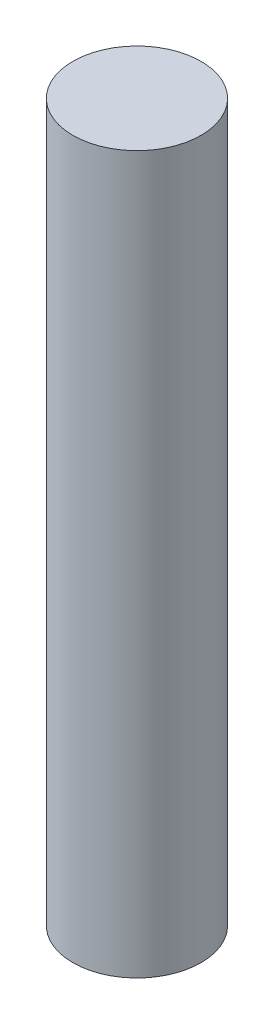
ISO-10303-21;
HEADER;
FILE_DESCRIPTION(('STEP AP214'),'2;1');
FILE_NAME('part.step','',(''),(''),'','','');
FILE_SCHEMA(('AUTOMOTIVE_DESIGN { 1 0 10303 214 1 1 1 1 }'));
ENDSEC;
DATA;
#1=APPLICATION_CONTEXT('core data for automotive mechanical design processes');
#2=APPLICATION_PROTOCOL_DEFINITION('international standard','automotive_design',2000,#1);
#3=PRODUCT_CONTEXT('',#1,'mechanical');
#4=PRODUCT('Part','Part','',(#3));
#5=PRODUCT_RELATED_PRODUCT_CATEGORY('part','',(#4));
#6=PRODUCT_DEFINITION_FORMATION('','',#4);
#7=PRODUCT_DEFINITION_CONTEXT('part definition',#1,'design');
#8=PRODUCT_DEFINITION('design','',#6,#7);
#9=PRODUCT_DEFINITION_SHAPE('','',#8);
#10=(LENGTH_UNIT() NAMED_UNIT(*) SI_UNIT(.MILLI.,.METRE.));
#11=(NAMED_UNIT(*) PLANE_ANGLE_UNIT() SI_UNIT($,.RADIAN.));
#12=(NAMED_UNIT(*) SI_UNIT($,.STERADIAN.) SOLID_ANGLE_UNIT());
#13=UNCERTAINTY_MEASURE_WITH_UNIT(LENGTH_MEASURE(1.E-05),#10,'distance_accuracy_value','');
#14=(GEOMETRIC_REPRESENTATION_CONTEXT(3) GLOBAL_UNCERTAINTY_ASSIGNED_CONTEXT((#13)) GLOBAL_UNIT_ASSIGNED_CONTEXT((#10,
#11,#12)) REPRESENTATION_CONTEXT('',''));
#15=CARTESIAN_POINT('',(0.,0.,0.));
#16=DIRECTION('',(0.,0.,1.));
#17=DIRECTION('',(1.,0.,0.));
#18=AXIS2_PLACEMENT_3D('',#15,#16,#17);
#19=CARTESIAN_POINT('',(0.,55.88,0.));
#20=DIRECTION('',(0.,-1.,0.));
#21=DIRECTION('',(0.,0.,-1.));
#22=AXIS2_PLACEMENT_3D('',#19,#20,#21);
#23=CYLINDRICAL_SURFACE('',#22,5.);
#24=CARTESIAN_POINT('',(0.,55.88,0.));
#25=DIRECTION('',(0.,1.,0.));
#26=DIRECTION('',(0.,0.,1.));
#27=AXIS2_PLACEMENT_3D('',#24,#25,#26);
#28=CIRCLE('',#27,5.);
#29=CARTESIAN_POINT('',(0.,55.88,5.));
#30=VERTEX_POINT('',#29);
#31=EDGE_CURVE('E10',#30,#30,#28,.T.);
#32=ORIENTED_EDGE('',*,*,#31,.F.);
#33=EDGE_LOOP('',(#32));
#34=FACE_BOUND('',#33,.T.);
#35=CARTESIAN_POINT('',(0.,0.,0.));
#36=DIRECTION('',(0.,1.,0.));
#37=DIRECTION('',(0.,0.,1.));
#38=AXIS2_PLACEMENT_3D('',#35,#36,#37);
#39=CIRCLE('',#38,5.);
#40=CARTESIAN_POINT('',(0.,0.,5.));
#41=VERTEX_POINT('',#40);
#42=EDGE_CURVE('E36',#41,#41,#39,.T.);
#43=ORIENTED_EDGE('',*,*,#42,.T.);
#44=EDGE_LOOP('',(#43));
#45=FACE_BOUND('',#44,.T.);
#46=ADVANCED_FACE('F33',(#34,#45),#23,.T.);
#47=CARTESIAN_POINT('',(0.,55.88,0.));
#48=DIRECTION('',(0.,1.,0.));
#49=DIRECTION('',(0.,0.,1.));
#50=AXIS2_PLACEMENT_3D('',#47,#48,#49);
#51=PLANE('',#50);
#52=ORIENTED_EDGE('',*,*,#31,.T.);
#53=EDGE_LOOP('',(#52));
#54=FACE_BOUND('',#53,.T.);
#55=ADVANCED_FACE('F48',(#54),#51,.T.);
#56=CARTESIAN_POINT('',(0.,0.,0.));
#57=DIRECTION('',(0.,1.,0.));
#58=DIRECTION('',(0.,0.,1.));
#59=AXIS2_PLACEMENT_3D('',#56,#57,#58);
#60=PLANE('',#59);
#61=ORIENTED_EDGE('',*,*,#42,.F.);
#62=EDGE_LOOP('',(#61));
#63=FACE_BOUND('',#62,.T.);
#64=ADVANCED_FACE('F46',(#63),#60,.F.);
#65=CLOSED_SHELL('',(#46,#55,#64));
#66=MANIFOLD_SOLID_BREP('B2',#65);
#67=ADVANCED_BREP_SHAPE_REPRESENTATION('',(#18,#66),#14);
#68=SHAPE_DEFINITION_REPRESENTATION(#9,#67);
ENDSEC;
END-ISO-10303-21;
